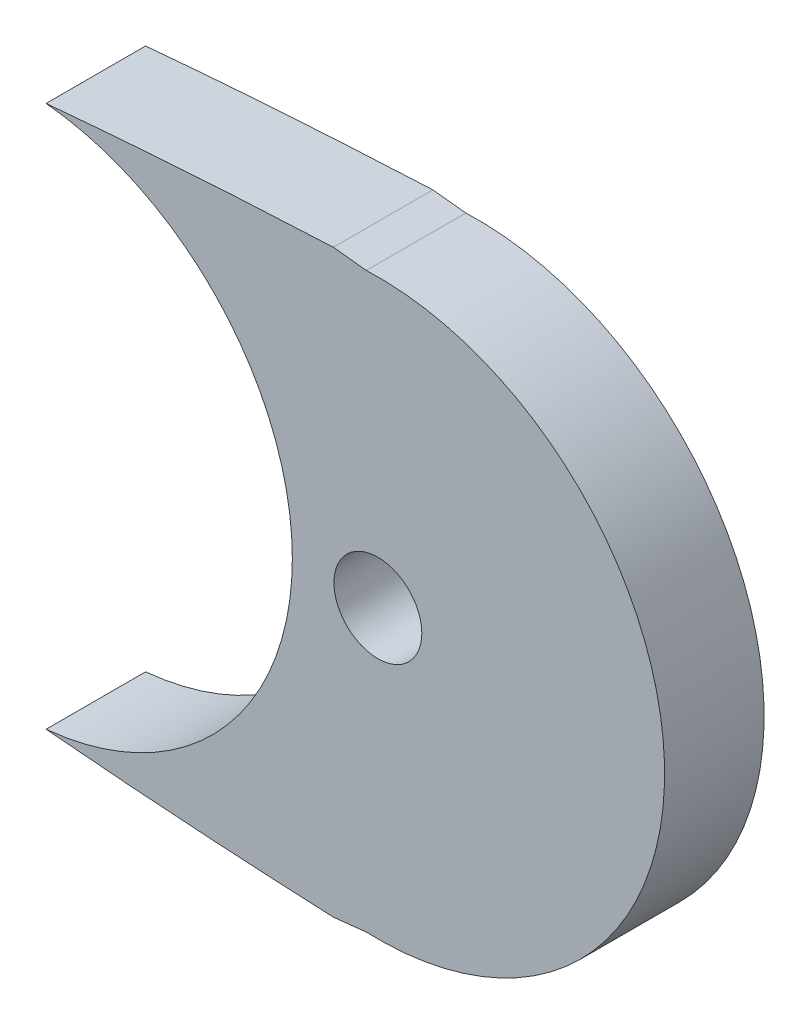
ISO-10303-21;
HEADER;
FILE_DESCRIPTION(('STEP AP214'),'2;1');
FILE_NAME('part.step','',(''),(''),'','','');
FILE_SCHEMA(('AUTOMOTIVE_DESIGN { 1 0 10303 214 1 1 1 1 }'));
ENDSEC;
DATA;
#1=APPLICATION_CONTEXT('core data for automotive mechanical design processes');
#2=APPLICATION_PROTOCOL_DEFINITION('international standard','automotive_design',2000,#1);
#3=PRODUCT_CONTEXT('',#1,'mechanical');
#4=PRODUCT('Part','Part','',(#3));
#5=PRODUCT_RELATED_PRODUCT_CATEGORY('part','',(#4));
#6=PRODUCT_DEFINITION_FORMATION('','',#4);
#7=PRODUCT_DEFINITION_CONTEXT('part definition',#1,'design');
#8=PRODUCT_DEFINITION('design','',#6,#7);
#9=PRODUCT_DEFINITION_SHAPE('','',#8);
#10=(LENGTH_UNIT() NAMED_UNIT(*) SI_UNIT(.MILLI.,.METRE.));
#11=(NAMED_UNIT(*) PLANE_ANGLE_UNIT() SI_UNIT($,.RADIAN.));
#12=(NAMED_UNIT(*) SI_UNIT($,.STERADIAN.) SOLID_ANGLE_UNIT());
#13=UNCERTAINTY_MEASURE_WITH_UNIT(LENGTH_MEASURE(1.E-05),#10,'distance_accuracy_value','');
#14=(GEOMETRIC_REPRESENTATION_CONTEXT(3) GLOBAL_UNCERTAINTY_ASSIGNED_CONTEXT((#13)) GLOBAL_UNIT_ASSIGNED_CONTEXT((#10,
#11,#12)) REPRESENTATION_CONTEXT('',''));
#15=CARTESIAN_POINT('',(0.,0.,0.));
#16=DIRECTION('',(0.,0.,1.));
#17=DIRECTION('',(1.,0.,0.));
#18=AXIS2_PLACEMENT_3D('',#15,#16,#17);
#19=CARTESIAN_POINT('',(300.,0.378,6.));
#20=CARTESIAN_POINT('',(299.845901447221,0.39961034336831,6.));
#21=CARTESIAN_POINT('',(299.230346714046,0.48593399083917,6.));
#22=CARTESIAN_POINT('',(297.848901683276,0.678531057447331,6.));
#23=CARTESIAN_POINT('',(295.556029122455,0.996787499241564,6.));
#24=CARTESIAN_POINT('',(292.365739581197,1.43343203295321,6.));
#25=CARTESIAN_POINT('',(288.297856433401,1.98344889126347,6.));
#26=CARTESIAN_POINT('',(283.377248038078,2.63572648359042,6.));
#27=CARTESIAN_POINT('',(277.63430498472,3.38149178862329,6.));
#28=CARTESIAN_POINT('',(271.104515413466,4.20901604095742,6.));
#29=CARTESIAN_POINT('',(263.828064626846,5.10718872872647,6.));
#30=CARTESIAN_POINT('',(255.849823781818,6.06276893212352,6.));
#31=CARTESIAN_POINT('',(247.21903434379,7.06424307195608,6.));
#32=CARTESIAN_POINT('',(237.988783489903,8.09787318806774,6.));
#33=CARTESIAN_POINT('',(228.216029511608,9.15107036010328,6.));
#34=CARTESIAN_POINT('',(217.961088379031,10.2107446574668,6.));
#35=CARTESIAN_POINT('',(207.287161839572,11.2632209265187,6.));
#36=CARTESIAN_POINT('',(196.260086850424,12.2937248064858,6.));
#37=CARTESIAN_POINT('',(184.947773044503,13.2887281219597,6.));
#38=CARTESIAN_POINT('',(173.420088229148,14.2315961384787,6.));
#39=CARTESIAN_POINT('',(161.747864995533,15.1069553720124,6.));
#40=CARTESIAN_POINT('',(150.00317252135,15.8985540753976,6.));
#41=CARTESIAN_POINT('',(138.258374542497,16.5898406039741,6.));
#42=CARTESIAN_POINT('',(126.585774705795,17.1633504747405,6.));
#43=CARTESIAN_POINT('',(115.057462615139,17.6037905135667,6.));
#44=CARTESIAN_POINT('',(103.744181572864,17.8967919128621,6.));
#45=CARTESIAN_POINT('',(92.7158453472272,18.0280433746414,6.));
#46=CARTESIAN_POINT('',(82.0402185013839,17.9871287273908,6.));
#47=CARTESIAN_POINT('',(71.7831190583338,17.7661449762132,6.));
#48=CARTESIAN_POINT('',(62.0076841473254,17.3594904245971,6.));
#49=CARTESIAN_POINT('',(52.7740834437817,16.7661013276277,6.));
#50=CARTESIAN_POINT('',(44.1390669938569,15.987763153894,6.));
#51=CARTESIAN_POINT('',(36.1554749512941,15.0305547578774,6.));
#52=CARTESIAN_POINT('',(28.8719698679608,13.9026205663682,6.));
#53=CARTESIAN_POINT('',(22.3326880228315,12.6157408879695,6.));
#54=CARTESIAN_POINT('',(16.5759570466198,11.1844668147641,6.));
#55=CARTESIAN_POINT('',(11.6344891822112,9.62275505380201,6.));
#56=CARTESIAN_POINT('',(7.53339032845527,7.94515078115887,6.));
#57=CARTESIAN_POINT('',(4.28573900369485,6.16300377839948,6.));
#58=CARTESIAN_POINT('',(1.8965325692393,4.27279663699588,6.));
#59=CARTESIAN_POINT('',(0.366265286449645,2.2288009510305,6.));
#60=CARTESIAN_POINT('',(-0.170692645797294,0.,6.));
#61=CARTESIAN_POINT('',(0.366265286449666,-2.22880095103055,6.));
#62=CARTESIAN_POINT('',(1.89653256923925,-4.27279663699582,6.));
#63=CARTESIAN_POINT('',(4.28573900369493,-6.16300377839955,6.));
#64=CARTESIAN_POINT('',(7.53339032845521,-7.94515078115883,6.));
#65=CARTESIAN_POINT('',(11.6344891822112,-9.62275505380201,6.));
#66=CARTESIAN_POINT('',(16.5759570466199,-11.1844668147641,6.));
#67=CARTESIAN_POINT('',(22.3326880228314,-12.6157408879695,6.));
#68=CARTESIAN_POINT('',(28.8719698679608,-13.9026205663682,6.));
#69=CARTESIAN_POINT('',(36.155474951294,-15.0305547578773,6.));
#70=CARTESIAN_POINT('',(44.1390669938569,-15.987763153894,6.));
#71=CARTESIAN_POINT('',(52.7740834437817,-16.7661013276277,6.));
#72=CARTESIAN_POINT('',(62.0076841473254,-17.3594904245971,6.));
#73=CARTESIAN_POINT('',(71.7831190583338,-17.7661449762132,6.));
#74=CARTESIAN_POINT('',(82.0402185013839,-17.9871287273908,6.));
#75=CARTESIAN_POINT('',(92.7158453472273,-18.0280433746414,6.));
#76=CARTESIAN_POINT('',(103.744181572864,-17.8967919128621,6.));
#77=CARTESIAN_POINT('',(115.057462615139,-17.6037905135667,6.));
#78=CARTESIAN_POINT('',(126.585774705795,-17.1633504747405,6.));
#79=CARTESIAN_POINT('',(138.258374542497,-16.5898406039741,6.));
#80=CARTESIAN_POINT('',(150.00317252135,-15.8985540753976,6.));
#81=CARTESIAN_POINT('',(161.747864995533,-15.1069553720124,6.));
#82=CARTESIAN_POINT('',(173.420088229148,-14.2315961384787,6.));
#83=CARTESIAN_POINT('',(184.947773044503,-13.2887281219597,6.));
#84=CARTESIAN_POINT('',(196.260086850424,-12.2937248064858,6.));
#85=CARTESIAN_POINT('',(207.287161839572,-11.2632209265187,6.));
#86=CARTESIAN_POINT('',(217.961088379031,-10.2107446574668,6.));
#87=CARTESIAN_POINT('',(228.216029511608,-9.15107036010328,6.));
#88=CARTESIAN_POINT('',(237.988783489903,-8.09787318806774,6.));
#89=CARTESIAN_POINT('',(247.21903434379,-7.06424307195608,6.));
#90=CARTESIAN_POINT('',(255.849823781818,-6.0627689321235,6.));
#91=CARTESIAN_POINT('',(263.828064626846,-5.10718872872648,6.));
#92=CARTESIAN_POINT('',(271.104515413466,-4.20901604095741,6.));
#93=CARTESIAN_POINT('',(277.63430498472,-3.38149178862329,6.));
#94=CARTESIAN_POINT('',(283.377248038078,-2.63572648359043,6.));
#95=CARTESIAN_POINT('',(288.297856433401,-1.98344889126346,6.));
#96=CARTESIAN_POINT('',(292.365739581198,-1.43343203295321,6.));
#97=CARTESIAN_POINT('',(295.556029122455,-0.996787499241567,6.));
#98=CARTESIAN_POINT('',(297.848901683276,-0.678531057447318,6.));
#99=CARTESIAN_POINT('',(299.230346714046,-0.48593399083919,6.));
#100=CARTESIAN_POINT('',(299.845901447221,-0.399610343368311,6.));
#101=CARTESIAN_POINT('',(300.,-0.378,6.));
#102=B_SPLINE_CURVE_WITH_KNOTS('',3,(#19,#20,#21,#22,#23,#24,#25,#26,#27,#28,#29,#30,#31,#32,
#33,#34,#35,#36,#37,#38,#39,#40,#41,#42,#43,#44,#45,#46,#47,#48,#49,#50,#51,#52,#53,#54,#55,#56,
#57,#58,#59,#60,#61,#62,#63,#64,#65,#66,#67,#68,#69,#70,#71,#72,#73,#74,#75,#76,#77,#78,#79,#80,
#81,#82,#83,#84,#85,#86,#87,#88,#89,#90,#91,#92,#93,#94,#95,#96,#97,#98,#99,#100,#101),
.UNSPECIFIED.,.F.,.F.,(4,1,1,1,1,1,1,1,1,1,1,1,1,1,1,1,1,1,1,1,1,1,1,1,1,1,1,1,1,1,1,1,1,1,1,1,
1,1,1,1,1,1,1,1,1,1,1,1,1,1,1,1,1,1,1,1,1,1,1,1,1,1,1,1,1,1,1,1,1,1,1,1,1,1,1,1,1,1,1,1,4),(0.,
0.000763156679271448,0.00304846929193477,0.00684068957953669,0.0121161317605396,
0.0188407924276644,0.0269727495182071,0.0364598537113803,0.0472429445210447,0.0592535547279477,
0.0724172643119224,0.0866510217067198,0.101866322474926,0.117968955401192,0.134857918638583,
0.152428309483259,0.170571841082248,0.189174521814913,0.208122338288737,0.227296649324545,
0.246580070424687,0.265853108019993,0.284996761496293,0.303895241632262,0.322432580929281,
0.340498658943124,0.357984483489282,0.37478811429809,0.390812303248415,0.405965006366899,
0.420162443159487,0.433328264782086,0.445393603392471,0.456301171479378,0.466003880875037,
0.474472000637231,0.481696232103684,0.487703697963338,0.492583405321472,0.496543603187854,0.5,
0.503456396812145,0.507416594678528,0.512296302036662,0.518303767896316,0.525527999362769,
0.533996119124963,0.543698828520622,0.554606396607529,0.566671735217914,0.579837556840513,
0.594034993633101,0.609187696751585,0.62521188570191,0.642015516510718,0.659501341056876,
0.677567419070719,0.696104758367738,0.715003238503707,0.734146891980006,0.753419929575313,
0.772703350675454,0.791877661711263,0.810825478185087,0.829428158917752,0.847571690516741,
0.865142081361417,0.882031044598807,0.898133677525074,0.91334897829328,0.927582735688077,
0.940746445272052,0.952757055478955,0.96354014628862,0.973027250481793,0.981159207572336,
0.98788386823946,0.993159310420463,0.996951530708065,0.999236843320729,1.),.UNSPECIFIED.);
#103=DIRECTION('',(0.,0.,-1.));
#104=VECTOR('',#103,1.);
#105=SURFACE_OF_LINEAR_EXTRUSION('',#102,#104);
#106=DIRECTION('',(0.,0.,1.));
#107=VECTOR('',#106,1.);
#108=CARTESIAN_POINT('',(65.5273106997542,17.4950200655024,0.));
#109=LINE('',#108,#107);
#110=CARTESIAN_POINT('',(65.5273106997542,17.4950200655024,0.));
#111=VERTEX_POINT('',#110);
#112=CARTESIAN_POINT('',(65.5273106997542,17.4950200655024,6.));
#113=VERTEX_POINT('',#112);
#114=EDGE_CURVE('E142',#111,#113,#109,.T.);
#115=ORIENTED_EDGE('',*,*,#114,.F.);
#116=CARTESIAN_POINT('',(300.,0.378,0.));
#117=CARTESIAN_POINT('',(299.845901447221,0.39961034336831,0.));
#118=CARTESIAN_POINT('',(299.230346714046,0.48593399083917,0.));
#119=CARTESIAN_POINT('',(297.848901683276,0.678531057447331,0.));
#120=CARTESIAN_POINT('',(295.556029122455,0.996787499241564,0.));
#121=CARTESIAN_POINT('',(292.365739581197,1.43343203295321,0.));
#122=CARTESIAN_POINT('',(288.297856433401,1.98344889126347,0.));
#123=CARTESIAN_POINT('',(283.377248038078,2.63572648359042,0.));
#124=CARTESIAN_POINT('',(277.63430498472,3.38149178862329,0.));
#125=CARTESIAN_POINT('',(271.104515413466,4.20901604095742,0.));
#126=CARTESIAN_POINT('',(263.828064626846,5.10718872872647,0.));
#127=CARTESIAN_POINT('',(255.849823781818,6.06276893212352,0.));
#128=CARTESIAN_POINT('',(247.21903434379,7.06424307195608,0.));
#129=CARTESIAN_POINT('',(237.988783489903,8.09787318806774,0.));
#130=CARTESIAN_POINT('',(228.216029511608,9.15107036010328,0.));
#131=CARTESIAN_POINT('',(217.961088379031,10.2107446574668,0.));
#132=CARTESIAN_POINT('',(207.287161839572,11.2632209265187,0.));
#133=CARTESIAN_POINT('',(196.260086850424,12.2937248064858,0.));
#134=CARTESIAN_POINT('',(184.947773044503,13.2887281219597,0.));
#135=CARTESIAN_POINT('',(173.420088229148,14.2315961384787,0.));
#136=CARTESIAN_POINT('',(161.747864995533,15.1069553720124,0.));
#137=CARTESIAN_POINT('',(150.00317252135,15.8985540753976,0.));
#138=CARTESIAN_POINT('',(138.258374542497,16.5898406039741,0.));
#139=CARTESIAN_POINT('',(126.585774705795,17.1633504747405,0.));
#140=CARTESIAN_POINT('',(115.057462615139,17.6037905135667,0.));
#141=CARTESIAN_POINT('',(103.744181572864,17.8967919128621,0.));
#142=CARTESIAN_POINT('',(92.7158453472272,18.0280433746414,0.));
#143=CARTESIAN_POINT('',(82.0402185013839,17.9871287273908,0.));
#144=CARTESIAN_POINT('',(71.7831190583338,17.7661449762132,0.));
#145=CARTESIAN_POINT('',(62.0076841473254,17.3594904245971,0.));
#146=CARTESIAN_POINT('',(52.7740834437817,16.7661013276277,0.));
#147=CARTESIAN_POINT('',(44.1390669938569,15.987763153894,0.));
#148=CARTESIAN_POINT('',(36.1554749512941,15.0305547578774,0.));
#149=CARTESIAN_POINT('',(28.8719698679608,13.9026205663682,0.));
#150=CARTESIAN_POINT('',(22.3326880228315,12.6157408879695,0.));
#151=CARTESIAN_POINT('',(16.5759570466198,11.1844668147641,0.));
#152=CARTESIAN_POINT('',(11.6344891822112,9.62275505380201,0.));
#153=CARTESIAN_POINT('',(7.53339032845527,7.94515078115887,0.));
#154=CARTESIAN_POINT('',(4.28573900369485,6.16300377839948,0.));
#155=CARTESIAN_POINT('',(1.8965325692393,4.27279663699588,0.));
#156=CARTESIAN_POINT('',(0.366265286449645,2.2288009510305,0.));
#157=CARTESIAN_POINT('',(-0.170692645797294,0.,0.));
#158=CARTESIAN_POINT('',(0.366265286449666,-2.22880095103055,0.));
#159=CARTESIAN_POINT('',(1.89653256923925,-4.27279663699582,0.));
#160=CARTESIAN_POINT('',(4.28573900369493,-6.16300377839955,0.));
#161=CARTESIAN_POINT('',(7.53339032845521,-7.94515078115883,0.));
#162=CARTESIAN_POINT('',(11.6344891822112,-9.62275505380201,0.));
#163=CARTESIAN_POINT('',(16.5759570466199,-11.1844668147641,0.));
#164=CARTESIAN_POINT('',(22.3326880228314,-12.6157408879695,0.));
#165=CARTESIAN_POINT('',(28.8719698679608,-13.9026205663682,0.));
#166=CARTESIAN_POINT('',(36.155474951294,-15.0305547578773,0.));
#167=CARTESIAN_POINT('',(44.1390669938569,-15.987763153894,0.));
#168=CARTESIAN_POINT('',(52.7740834437817,-16.7661013276277,0.));
#169=CARTESIAN_POINT('',(62.0076841473254,-17.3594904245971,0.));
#170=CARTESIAN_POINT('',(71.7831190583338,-17.7661449762132,0.));
#171=CARTESIAN_POINT('',(82.0402185013839,-17.9871287273908,0.));
#172=CARTESIAN_POINT('',(92.7158453472273,-18.0280433746414,0.));
#173=CARTESIAN_POINT('',(103.744181572864,-17.8967919128621,0.));
#174=CARTESIAN_POINT('',(115.057462615139,-17.6037905135667,0.));
#175=CARTESIAN_POINT('',(126.585774705795,-17.1633504747405,0.));
#176=CARTESIAN_POINT('',(138.258374542497,-16.5898406039741,0.));
#177=CARTESIAN_POINT('',(150.00317252135,-15.8985540753976,0.));
#178=CARTESIAN_POINT('',(161.747864995533,-15.1069553720124,0.));
#179=CARTESIAN_POINT('',(173.420088229148,-14.2315961384787,0.));
#180=CARTESIAN_POINT('',(184.947773044503,-13.2887281219597,0.));
#181=CARTESIAN_POINT('',(196.260086850424,-12.2937248064858,0.));
#182=CARTESIAN_POINT('',(207.287161839572,-11.2632209265187,0.));
#183=CARTESIAN_POINT('',(217.961088379031,-10.2107446574668,0.));
#184=CARTESIAN_POINT('',(228.216029511608,-9.15107036010328,0.));
#185=CARTESIAN_POINT('',(237.988783489903,-8.09787318806774,0.));
#186=CARTESIAN_POINT('',(247.21903434379,-7.06424307195608,0.));
#187=CARTESIAN_POINT('',(255.849823781818,-6.0627689321235,0.));
#188=CARTESIAN_POINT('',(263.828064626846,-5.10718872872648,0.));
#189=CARTESIAN_POINT('',(271.104515413466,-4.20901604095741,0.));
#190=CARTESIAN_POINT('',(277.63430498472,-3.38149178862329,0.));
#191=CARTESIAN_POINT('',(283.377248038078,-2.63572648359043,0.));
#192=CARTESIAN_POINT('',(288.297856433401,-1.98344889126346,0.));
#193=CARTESIAN_POINT('',(292.365739581198,-1.43343203295321,0.));
#194=CARTESIAN_POINT('',(295.556029122455,-0.996787499241567,0.));
#195=CARTESIAN_POINT('',(297.848901683276,-0.678531057447318,0.));
#196=CARTESIAN_POINT('',(299.230346714046,-0.48593399083919,0.));
#197=CARTESIAN_POINT('',(299.845901447221,-0.399610343368311,0.));
#198=CARTESIAN_POINT('',(300.,-0.378,0.));
#199=B_SPLINE_CURVE_WITH_KNOTS('',3,(#116,#117,#118,#119,#120,#121,#122,#123,#124,#125,#126,
#127,#128,#129,#130,#131,#132,#133,#134,#135,#136,#137,#138,#139,#140,#141,#142,#143,#144,#145,
#146,#147,#148,#149,#150,#151,#152,#153,#154,#155,#156,#157,#158,#159,#160,#161,#162,#163,#164,
#165,#166,#167,#168,#169,#170,#171,#172,#173,#174,#175,#176,#177,#178,#179,#180,#181,#182,#183,
#184,#185,#186,#187,#188,#189,#190,#191,#192,#193,#194,#195,#196,#197,#198),.UNSPECIFIED.,.F.,
.F.,(4,1,1,1,1,1,1,1,1,1,1,1,1,1,1,1,1,1,1,1,1,1,1,1,1,1,1,1,1,1,1,1,1,1,1,1,1,1,1,1,1,1,1,1,1,
1,1,1,1,1,1,1,1,1,1,1,1,1,1,1,1,1,1,1,1,1,1,1,1,1,1,1,1,1,1,1,1,1,1,1,4),(0.,
0.000763156679271448,0.00304846929193477,0.00684068957953669,0.0121161317605396,
0.0188407924276644,0.0269727495182071,0.0364598537113803,0.0472429445210447,0.0592535547279477,
0.0724172643119224,0.0866510217067198,0.101866322474926,0.117968955401192,0.134857918638583,
0.152428309483259,0.170571841082248,0.189174521814913,0.208122338288737,0.227296649324545,
0.246580070424687,0.265853108019993,0.284996761496293,0.303895241632262,0.322432580929281,
0.340498658943124,0.357984483489282,0.37478811429809,0.390812303248415,0.405965006366899,
0.420162443159487,0.433328264782086,0.445393603392471,0.456301171479378,0.466003880875037,
0.474472000637231,0.481696232103684,0.487703697963338,0.492583405321472,0.496543603187854,0.5,
0.503456396812145,0.507416594678528,0.512296302036662,0.518303767896316,0.525527999362769,
0.533996119124963,0.543698828520622,0.554606396607529,0.566671735217914,0.579837556840513,
0.594034993633101,0.609187696751585,0.62521188570191,0.642015516510718,0.659501341056876,
0.677567419070719,0.696104758367738,0.715003238503707,0.734146891980006,0.753419929575313,
0.772703350675454,0.791877661711263,0.810825478185087,0.829428158917752,0.847571690516741,
0.865142081361417,0.882031044598807,0.898133677525074,0.91334897829328,0.927582735688077,
0.940746445272052,0.952757055478955,0.96354014628862,0.973027250481793,0.981159207572336,
0.98788386823946,0.993159310420463,0.996951530708065,0.999236843320729,1.),.UNSPECIFIED.);
#200=CARTESIAN_POINT('',(48.1975371862923,16.3434678002833,0.));
#201=VERTEX_POINT('',#200);
#202=EDGE_CURVE('E210',#111,#201,#199,.T.);
#203=ORIENTED_EDGE('',*,*,#202,.T.);
#204=DIRECTION('',(0.,0.,1.));
#205=VECTOR('',#204,1.);
#206=CARTESIAN_POINT('',(48.1975371862922,16.3434678002833,0.));
#207=LINE('',#206,#205);
#208=CARTESIAN_POINT('',(48.1975371862922,16.3434678002833,6.));
#209=VERTEX_POINT('',#208);
#210=EDGE_CURVE('E64',#201,#209,#207,.T.);
#211=ORIENTED_EDGE('',*,*,#210,.T.);
#212=EDGE_CURVE('E56',#113,#209,#102,.T.);
#213=ORIENTED_EDGE('',*,*,#212,.F.);
#214=EDGE_LOOP('',(#115,#203,#211,#213));
#215=FACE_BOUND('',#214,.T.);
#216=ADVANCED_FACE('F45',(#215),#105,.F.);
#217=CARTESIAN_POINT('',(0.,0.,6.));
#218=DIRECTION('',(0.,0.,1.));
#219=DIRECTION('',(1.,0.,0.));
#220=AXIS2_PLACEMENT_3D('',#217,#218,#219);
#221=PLANE('',#220);
#222=CARTESIAN_POINT('',(68.2098517870718,0.,6.));
#223=DIRECTION('',(0.,0.,1.));
#224=DIRECTION('',(1.,0.,0.));
#225=AXIS2_PLACEMENT_3D('',#222,#223,#224);
#226=CIRCLE('',#225,2.65);
#227=CARTESIAN_POINT('',(70.8598517870718,0.,6.));
#228=VERTEX_POINT('',#227);
#229=EDGE_CURVE('E11',#228,#228,#226,.T.);
#230=ORIENTED_EDGE('',*,*,#229,.F.);
#231=EDGE_LOOP('',(#230));
#232=FACE_BOUND('',#231,.T.);
#233=CARTESIAN_POINT('',(68.2098517870718,0.,6.));
#234=DIRECTION('',(0.,0.,1.));
#235=DIRECTION('',(1.,0.,0.));
#236=AXIS2_PLACEMENT_3D('',#233,#234,#235);
#237=CIRCLE('',#236,17.2932548417885);
#238=CARTESIAN_POINT('',(67.5121043853475,-17.2791727691585,6.));
#239=VERTEX_POINT('',#238);
#240=CARTESIAN_POINT('',(67.5121043853475,17.2791727691584,6.));
#241=VERTEX_POINT('',#240);
#242=EDGE_CURVE('E109',#239,#241,#237,.T.);
#243=ORIENTED_EDGE('',*,*,#242,.T.);
#244=DIRECTION('',(-0.994138604542644,0.108113065621152,0.));
#245=VECTOR('',#244,1.);
#246=CARTESIAN_POINT('',(2.6462654821681,24.3333648766431,6.));
#247=LINE('',#246,#245);
#248=EDGE_CURVE('E125',#241,#113,#247,.T.);
#249=ORIENTED_EDGE('',*,*,#248,.T.);
#250=ORIENTED_EDGE('',*,*,#212,.T.);
#251=CARTESIAN_POINT('',(46.632238895324,0.,6.));
#252=DIRECTION('',(0.,0.,1.));
#253=DIRECTION('',(1.,0.,0.));
#254=AXIS2_PLACEMENT_3D('',#251,#252,#253);
#255=CIRCLE('',#254,16.4182550375673);
#256=CARTESIAN_POINT('',(48.1975371862863,-16.3434678002827,6.));
#257=VERTEX_POINT('',#256);
#258=EDGE_CURVE('E151',#257,#209,#255,.T.);
#259=ORIENTED_EDGE('',*,*,#258,.F.);
#260=CARTESIAN_POINT('',(300.,0.378,6.));
#261=CARTESIAN_POINT('',(299.845901447221,0.39961034336831,6.));
#262=CARTESIAN_POINT('',(299.230346714046,0.48593399083917,6.));
#263=CARTESIAN_POINT('',(297.848901683276,0.678531057447331,6.));
#264=CARTESIAN_POINT('',(295.556029122455,0.996787499241564,6.));
#265=CARTESIAN_POINT('',(292.365739581197,1.43343203295321,6.));
#266=CARTESIAN_POINT('',(288.297856433401,1.98344889126347,6.));
#267=CARTESIAN_POINT('',(283.377248038078,2.63572648359042,6.));
#268=CARTESIAN_POINT('',(277.63430498472,3.38149178862329,6.));
#269=CARTESIAN_POINT('',(271.104515413466,4.20901604095742,6.));
#270=CARTESIAN_POINT('',(263.828064626846,5.10718872872647,6.));
#271=CARTESIAN_POINT('',(255.849823781818,6.06276893212352,6.));
#272=CARTESIAN_POINT('',(247.21903434379,7.06424307195608,6.));
#273=CARTESIAN_POINT('',(237.988783489903,8.09787318806774,6.));
#274=CARTESIAN_POINT('',(228.216029511608,9.15107036010328,6.));
#275=CARTESIAN_POINT('',(217.961088379031,10.2107446574668,6.));
#276=CARTESIAN_POINT('',(207.287161839572,11.2632209265187,6.));
#277=CARTESIAN_POINT('',(196.260086850424,12.2937248064858,6.));
#278=CARTESIAN_POINT('',(184.947773044503,13.2887281219597,6.));
#279=CARTESIAN_POINT('',(173.420088229148,14.2315961384787,6.));
#280=CARTESIAN_POINT('',(161.747864995533,15.1069553720124,6.));
#281=CARTESIAN_POINT('',(150.00317252135,15.8985540753976,6.));
#282=CARTESIAN_POINT('',(138.258374542497,16.5898406039741,6.));
#283=CARTESIAN_POINT('',(126.585774705795,17.1633504747405,6.));
#284=CARTESIAN_POINT('',(115.057462615139,17.6037905135667,6.));
#285=CARTESIAN_POINT('',(103.744181572864,17.8967919128621,6.));
#286=CARTESIAN_POINT('',(92.7158453472272,18.0280433746414,6.));
#287=CARTESIAN_POINT('',(82.0402185013839,17.9871287273908,6.));
#288=CARTESIAN_POINT('',(71.7831190583338,17.7661449762132,6.));
#289=CARTESIAN_POINT('',(62.0076841473254,17.3594904245971,6.));
#290=CARTESIAN_POINT('',(52.7740834437817,16.7661013276277,6.));
#291=CARTESIAN_POINT('',(44.1390669938569,15.987763153894,6.));
#292=CARTESIAN_POINT('',(36.1554749512941,15.0305547578774,6.));
#293=CARTESIAN_POINT('',(28.8719698679608,13.9026205663682,6.));
#294=CARTESIAN_POINT('',(22.3326880228315,12.6157408879695,6.));
#295=CARTESIAN_POINT('',(16.5759570466198,11.1844668147641,6.));
#296=CARTESIAN_POINT('',(11.6344891822112,9.62275505380201,6.));
#297=CARTESIAN_POINT('',(7.53339032845527,7.94515078115887,6.));
#298=CARTESIAN_POINT('',(4.28573900369485,6.16300377839948,6.));
#299=CARTESIAN_POINT('',(1.8965325692393,4.27279663699588,6.));
#300=CARTESIAN_POINT('',(0.366265286449645,2.2288009510305,6.));
#301=CARTESIAN_POINT('',(-0.170692645797294,0.,6.));
#302=CARTESIAN_POINT('',(0.366265286449666,-2.22880095103055,6.));
#303=CARTESIAN_POINT('',(1.89653256923925,-4.27279663699582,6.));
#304=CARTESIAN_POINT('',(4.28573900369493,-6.16300377839955,6.));
#305=CARTESIAN_POINT('',(7.53339032845521,-7.94515078115883,6.));
#306=CARTESIAN_POINT('',(11.6344891822112,-9.62275505380201,6.));
#307=CARTESIAN_POINT('',(16.5759570466199,-11.1844668147641,6.));
#308=CARTESIAN_POINT('',(22.3326880228314,-12.6157408879695,6.));
#309=CARTESIAN_POINT('',(28.8719698679608,-13.9026205663682,6.));
#310=CARTESIAN_POINT('',(36.155474951294,-15.0305547578773,6.));
#311=CARTESIAN_POINT('',(44.1390669938569,-15.987763153894,6.));
#312=CARTESIAN_POINT('',(52.7740834437817,-16.7661013276277,6.));
#313=CARTESIAN_POINT('',(62.0076841473254,-17.3594904245971,6.));
#314=CARTESIAN_POINT('',(71.7831190583338,-17.7661449762132,6.));
#315=CARTESIAN_POINT('',(82.0402185013839,-17.9871287273908,6.));
#316=CARTESIAN_POINT('',(92.7158453472273,-18.0280433746414,6.));
#317=CARTESIAN_POINT('',(103.744181572864,-17.8967919128621,6.));
#318=CARTESIAN_POINT('',(115.057462615139,-17.6037905135667,6.));
#319=CARTESIAN_POINT('',(126.585774705795,-17.1633504747405,6.));
#320=CARTESIAN_POINT('',(138.258374542497,-16.5898406039741,6.));
#321=CARTESIAN_POINT('',(150.00317252135,-15.8985540753976,6.));
#322=CARTESIAN_POINT('',(161.747864995533,-15.1069553720124,6.));
#323=CARTESIAN_POINT('',(173.420088229148,-14.2315961384787,6.));
#324=CARTESIAN_POINT('',(184.947773044503,-13.2887281219597,6.));
#325=CARTESIAN_POINT('',(196.260086850424,-12.2937248064858,6.));
#326=CARTESIAN_POINT('',(207.287161839572,-11.2632209265187,6.));
#327=CARTESIAN_POINT('',(217.961088379031,-10.2107446574668,6.));
#328=CARTESIAN_POINT('',(228.216029511608,-9.15107036010328,6.));
#329=CARTESIAN_POINT('',(237.988783489903,-8.09787318806774,6.));
#330=CARTESIAN_POINT('',(247.21903434379,-7.06424307195608,6.));
#331=CARTESIAN_POINT('',(255.849823781818,-6.0627689321235,6.));
#332=CARTESIAN_POINT('',(263.828064626846,-5.10718872872648,6.));
#333=CARTESIAN_POINT('',(271.104515413466,-4.20901604095741,6.));
#334=CARTESIAN_POINT('',(277.63430498472,-3.38149178862329,6.));
#335=CARTESIAN_POINT('',(283.377248038078,-2.63572648359043,6.));
#336=CARTESIAN_POINT('',(288.297856433401,-1.98344889126346,6.));
#337=CARTESIAN_POINT('',(292.365739581198,-1.43343203295321,6.));
#338=CARTESIAN_POINT('',(295.556029122455,-0.996787499241567,6.));
#339=CARTESIAN_POINT('',(297.848901683276,-0.678531057447318,6.));
#340=CARTESIAN_POINT('',(299.230346714046,-0.48593399083919,6.));
#341=CARTESIAN_POINT('',(299.845901447221,-0.399610343368311,6.));
#342=CARTESIAN_POINT('',(300.,-0.378,6.));
#343=B_SPLINE_CURVE_WITH_KNOTS('',3,(#260,#261,#262,#263,#264,#265,#266,#267,#268,#269,#270,
#271,#272,#273,#274,#275,#276,#277,#278,#279,#280,#281,#282,#283,#284,#285,#286,#287,#288,#289,
#290,#291,#292,#293,#294,#295,#296,#297,#298,#299,#300,#301,#302,#303,#304,#305,#306,#307,#308,
#309,#310,#311,#312,#313,#314,#315,#316,#317,#318,#319,#320,#321,#322,#323,#324,#325,#326,#327,
#328,#329,#330,#331,#332,#333,#334,#335,#336,#337,#338,#339,#340,#341,#342),.UNSPECIFIED.,.F.,
.F.,(4,1,1,1,1,1,1,1,1,1,1,1,1,1,1,1,1,1,1,1,1,1,1,1,1,1,1,1,1,1,1,1,1,1,1,1,1,1,1,1,1,1,1,1,1,
1,1,1,1,1,1,1,1,1,1,1,1,1,1,1,1,1,1,1,1,1,1,1,1,1,1,1,1,1,1,1,1,1,1,1,4),(0.,
0.000763156679271448,0.00304846929193477,0.00684068957953669,0.0121161317605396,
0.0188407924276644,0.0269727495182071,0.0364598537113803,0.0472429445210447,0.0592535547279477,
0.0724172643119224,0.0866510217067198,0.101866322474926,0.117968955401192,0.134857918638583,
0.152428309483259,0.170571841082248,0.189174521814913,0.208122338288737,0.227296649324545,
0.246580070424687,0.265853108019993,0.284996761496293,0.303895241632262,0.322432580929281,
0.340498658943124,0.357984483489282,0.37478811429809,0.390812303248415,0.405965006366899,
0.420162443159487,0.433328264782086,0.445393603392471,0.456301171479378,0.466003880875037,
0.474472000637231,0.481696232103684,0.487703697963338,0.492583405321472,0.496543603187854,0.5,
0.503456396812145,0.507416594678528,0.512296302036662,0.518303767896316,0.525527999362769,
0.533996119124963,0.543698828520622,0.554606396607529,0.566671735217914,0.579837556840513,
0.594034993633101,0.609187696751585,0.62521188570191,0.642015516510718,0.659501341056876,
0.677567419070719,0.696104758367738,0.715003238503707,0.734146891980006,0.753419929575313,
0.772703350675454,0.791877661711263,0.810825478185087,0.829428158917752,0.847571690516741,
0.865142081361417,0.882031044598807,0.898133677525074,0.91334897829328,0.927582735688077,
0.940746445272052,0.952757055478955,0.96354014628862,0.973027250481793,0.981159207572336,
0.98788386823946,0.993159310420463,0.996951530708065,0.999236843320729,1.),.UNSPECIFIED.);
#344=CARTESIAN_POINT('',(65.5273106997527,-17.4950200655023,6.));
#345=VERTEX_POINT('',#344);
#346=EDGE_CURVE('E157',#257,#345,#343,.T.);
#347=ORIENTED_EDGE('',*,*,#346,.T.);
#348=DIRECTION('',(-0.994138604542659,-0.108113065621023,0.));
#349=VECTOR('',#348,1.);
#350=CARTESIAN_POINT('',(2.64626548216401,-24.333364876635,6.));
#351=LINE('',#350,#349);
#352=EDGE_CURVE('E129',#239,#345,#351,.T.);
#353=ORIENTED_EDGE('',*,*,#352,.F.);
#354=EDGE_LOOP('',(#243,#249,#250,#259,#347,#353));
#355=FACE_BOUND('',#354,.T.);
#356=ADVANCED_FACE('F178',(#232,#355),#221,.T.);
#357=CARTESIAN_POINT('',(0.,0.,0.));
#358=DIRECTION('',(0.,0.,1.));
#359=DIRECTION('',(1.,0.,0.));
#360=AXIS2_PLACEMENT_3D('',#357,#358,#359);
#361=PLANE('',#360);
#362=CARTESIAN_POINT('',(68.2098517870718,0.,0.));
#363=DIRECTION('',(0.,0.,1.));
#364=DIRECTION('',(1.,0.,0.));
#365=AXIS2_PLACEMENT_3D('',#362,#363,#364);
#366=CIRCLE('',#365,2.65);
#367=CARTESIAN_POINT('',(70.8598517870718,0.,0.));
#368=VERTEX_POINT('',#367);
#369=EDGE_CURVE('E50',#368,#368,#366,.T.);
#370=ORIENTED_EDGE('',*,*,#369,.T.);
#371=EDGE_LOOP('',(#370));
#372=FACE_BOUND('',#371,.T.);
#373=DIRECTION('',(-0.994138604542644,0.108113065621152,0.));
#374=VECTOR('',#373,1.);
#375=CARTESIAN_POINT('',(2.6462654821681,24.3333648766431,0.));
#376=LINE('',#375,#374);
#377=CARTESIAN_POINT('',(67.5121043853475,17.2791727691584,0.));
#378=VERTEX_POINT('',#377);
#379=EDGE_CURVE('E112',#378,#111,#376,.T.);
#380=ORIENTED_EDGE('',*,*,#379,.F.);
#381=CARTESIAN_POINT('',(68.2098517870718,0.,0.));
#382=DIRECTION('',(0.,0.,1.));
#383=DIRECTION('',(1.,0.,0.));
#384=AXIS2_PLACEMENT_3D('',#381,#382,#383);
#385=CIRCLE('',#384,17.2932548417885);
#386=CARTESIAN_POINT('',(67.5121043853475,-17.2791727691585,0.));
#387=VERTEX_POINT('',#386);
#388=EDGE_CURVE('E106',#387,#378,#385,.T.);
#389=ORIENTED_EDGE('',*,*,#388,.F.);
#390=DIRECTION('',(-0.994138604542659,-0.108113065621023,0.));
#391=VECTOR('',#390,1.);
#392=CARTESIAN_POINT('',(2.64626548216401,-24.333364876635,0.));
#393=LINE('',#392,#391);
#394=CARTESIAN_POINT('',(65.5273106997527,-17.4950200655023,0.));
#395=VERTEX_POINT('',#394);
#396=EDGE_CURVE('E114',#387,#395,#393,.T.);
#397=ORIENTED_EDGE('',*,*,#396,.T.);
#398=CARTESIAN_POINT('',(300.,0.378,0.));
#399=CARTESIAN_POINT('',(299.845901447221,0.39961034336831,0.));
#400=CARTESIAN_POINT('',(299.230346714046,0.48593399083917,0.));
#401=CARTESIAN_POINT('',(297.848901683276,0.678531057447331,0.));
#402=CARTESIAN_POINT('',(295.556029122455,0.996787499241564,0.));
#403=CARTESIAN_POINT('',(292.365739581197,1.43343203295321,0.));
#404=CARTESIAN_POINT('',(288.297856433401,1.98344889126347,0.));
#405=CARTESIAN_POINT('',(283.377248038078,2.63572648359042,0.));
#406=CARTESIAN_POINT('',(277.63430498472,3.38149178862329,0.));
#407=CARTESIAN_POINT('',(271.104515413466,4.20901604095742,0.));
#408=CARTESIAN_POINT('',(263.828064626846,5.10718872872647,0.));
#409=CARTESIAN_POINT('',(255.849823781818,6.06276893212352,0.));
#410=CARTESIAN_POINT('',(247.21903434379,7.06424307195608,0.));
#411=CARTESIAN_POINT('',(237.988783489903,8.09787318806774,0.));
#412=CARTESIAN_POINT('',(228.216029511608,9.15107036010328,0.));
#413=CARTESIAN_POINT('',(217.961088379031,10.2107446574668,0.));
#414=CARTESIAN_POINT('',(207.287161839572,11.2632209265187,0.));
#415=CARTESIAN_POINT('',(196.260086850424,12.2937248064858,0.));
#416=CARTESIAN_POINT('',(184.947773044503,13.2887281219597,0.));
#417=CARTESIAN_POINT('',(173.420088229148,14.2315961384787,0.));
#418=CARTESIAN_POINT('',(161.747864995533,15.1069553720124,0.));
#419=CARTESIAN_POINT('',(150.00317252135,15.8985540753976,0.));
#420=CARTESIAN_POINT('',(138.258374542497,16.5898406039741,0.));
#421=CARTESIAN_POINT('',(126.585774705795,17.1633504747405,0.));
#422=CARTESIAN_POINT('',(115.057462615139,17.6037905135667,0.));
#423=CARTESIAN_POINT('',(103.744181572864,17.8967919128621,0.));
#424=CARTESIAN_POINT('',(92.7158453472272,18.0280433746414,0.));
#425=CARTESIAN_POINT('',(82.0402185013839,17.9871287273908,0.));
#426=CARTESIAN_POINT('',(71.7831190583338,17.7661449762132,0.));
#427=CARTESIAN_POINT('',(62.0076841473254,17.3594904245971,0.));
#428=CARTESIAN_POINT('',(52.7740834437817,16.7661013276277,0.));
#429=CARTESIAN_POINT('',(44.1390669938569,15.987763153894,0.));
#430=CARTESIAN_POINT('',(36.1554749512941,15.0305547578774,0.));
#431=CARTESIAN_POINT('',(28.8719698679608,13.9026205663682,0.));
#432=CARTESIAN_POINT('',(22.3326880228315,12.6157408879695,0.));
#433=CARTESIAN_POINT('',(16.5759570466198,11.1844668147641,0.));
#434=CARTESIAN_POINT('',(11.6344891822112,9.62275505380201,0.));
#435=CARTESIAN_POINT('',(7.53339032845527,7.94515078115887,0.));
#436=CARTESIAN_POINT('',(4.28573900369485,6.16300377839948,0.));
#437=CARTESIAN_POINT('',(1.8965325692393,4.27279663699588,0.));
#438=CARTESIAN_POINT('',(0.366265286449645,2.2288009510305,0.));
#439=CARTESIAN_POINT('',(-0.170692645797294,0.,0.));
#440=CARTESIAN_POINT('',(0.366265286449666,-2.22880095103055,0.));
#441=CARTESIAN_POINT('',(1.89653256923925,-4.27279663699582,0.));
#442=CARTESIAN_POINT('',(4.28573900369493,-6.16300377839955,0.));
#443=CARTESIAN_POINT('',(7.53339032845521,-7.94515078115883,0.));
#444=CARTESIAN_POINT('',(11.6344891822112,-9.62275505380201,0.));
#445=CARTESIAN_POINT('',(16.5759570466199,-11.1844668147641,0.));
#446=CARTESIAN_POINT('',(22.3326880228314,-12.6157408879695,0.));
#447=CARTESIAN_POINT('',(28.8719698679608,-13.9026205663682,0.));
#448=CARTESIAN_POINT('',(36.155474951294,-15.0305547578773,0.));
#449=CARTESIAN_POINT('',(44.1390669938569,-15.987763153894,0.));
#450=CARTESIAN_POINT('',(52.7740834437817,-16.7661013276277,0.));
#451=CARTESIAN_POINT('',(62.0076841473254,-17.3594904245971,0.));
#452=CARTESIAN_POINT('',(71.7831190583338,-17.7661449762132,0.));
#453=CARTESIAN_POINT('',(82.0402185013839,-17.9871287273908,0.));
#454=CARTESIAN_POINT('',(92.7158453472273,-18.0280433746414,0.));
#455=CARTESIAN_POINT('',(103.744181572864,-17.8967919128621,0.));
#456=CARTESIAN_POINT('',(115.057462615139,-17.6037905135667,0.));
#457=CARTESIAN_POINT('',(126.585774705795,-17.1633504747405,0.));
#458=CARTESIAN_POINT('',(138.258374542497,-16.5898406039741,0.));
#459=CARTESIAN_POINT('',(150.00317252135,-15.8985540753976,0.));
#460=CARTESIAN_POINT('',(161.747864995533,-15.1069553720124,0.));
#461=CARTESIAN_POINT('',(173.420088229148,-14.2315961384787,0.));
#462=CARTESIAN_POINT('',(184.947773044503,-13.2887281219597,0.));
#463=CARTESIAN_POINT('',(196.260086850424,-12.2937248064858,0.));
#464=CARTESIAN_POINT('',(207.287161839572,-11.2632209265187,0.));
#465=CARTESIAN_POINT('',(217.961088379031,-10.2107446574668,0.));
#466=CARTESIAN_POINT('',(228.216029511608,-9.15107036010328,0.));
#467=CARTESIAN_POINT('',(237.988783489903,-8.09787318806774,0.));
#468=CARTESIAN_POINT('',(247.21903434379,-7.06424307195608,0.));
#469=CARTESIAN_POINT('',(255.849823781818,-6.0627689321235,0.));
#470=CARTESIAN_POINT('',(263.828064626846,-5.10718872872648,0.));
#471=CARTESIAN_POINT('',(271.104515413466,-4.20901604095741,0.));
#472=CARTESIAN_POINT('',(277.63430498472,-3.38149178862329,0.));
#473=CARTESIAN_POINT('',(283.377248038078,-2.63572648359043,0.));
#474=CARTESIAN_POINT('',(288.297856433401,-1.98344889126346,0.));
#475=CARTESIAN_POINT('',(292.365739581198,-1.43343203295321,0.));
#476=CARTESIAN_POINT('',(295.556029122455,-0.996787499241567,0.));
#477=CARTESIAN_POINT('',(297.848901683276,-0.678531057447318,0.));
#478=CARTESIAN_POINT('',(299.230346714046,-0.48593399083919,0.));
#479=CARTESIAN_POINT('',(299.845901447221,-0.399610343368311,0.));
#480=CARTESIAN_POINT('',(300.,-0.378,0.));
#481=B_SPLINE_CURVE_WITH_KNOTS('',3,(#398,#399,#400,#401,#402,#403,#404,#405,#406,#407,#408,
#409,#410,#411,#412,#413,#414,#415,#416,#417,#418,#419,#420,#421,#422,#423,#424,#425,#426,#427,
#428,#429,#430,#431,#432,#433,#434,#435,#436,#437,#438,#439,#440,#441,#442,#443,#444,#445,#446,
#447,#448,#449,#450,#451,#452,#453,#454,#455,#456,#457,#458,#459,#460,#461,#462,#463,#464,#465,
#466,#467,#468,#469,#470,#471,#472,#473,#474,#475,#476,#477,#478,#479,#480),.UNSPECIFIED.,.F.,
.F.,(4,1,1,1,1,1,1,1,1,1,1,1,1,1,1,1,1,1,1,1,1,1,1,1,1,1,1,1,1,1,1,1,1,1,1,1,1,1,1,1,1,1,1,1,1,
1,1,1,1,1,1,1,1,1,1,1,1,1,1,1,1,1,1,1,1,1,1,1,1,1,1,1,1,1,1,1,1,1,1,1,4),(0.,
0.000763156679271448,0.00304846929193477,0.00684068957953669,0.0121161317605396,
0.0188407924276644,0.0269727495182071,0.0364598537113803,0.0472429445210447,0.0592535547279477,
0.0724172643119224,0.0866510217067198,0.101866322474926,0.117968955401192,0.134857918638583,
0.152428309483259,0.170571841082248,0.189174521814913,0.208122338288737,0.227296649324545,
0.246580070424687,0.265853108019993,0.284996761496293,0.303895241632262,0.322432580929281,
0.340498658943124,0.357984483489282,0.37478811429809,0.390812303248415,0.405965006366899,
0.420162443159487,0.433328264782086,0.445393603392471,0.456301171479378,0.466003880875037,
0.474472000637231,0.481696232103684,0.487703697963338,0.492583405321472,0.496543603187854,0.5,
0.503456396812145,0.507416594678528,0.512296302036662,0.518303767896316,0.525527999362769,
0.533996119124963,0.543698828520622,0.554606396607529,0.566671735217914,0.579837556840513,
0.594034993633101,0.609187696751585,0.62521188570191,0.642015516510718,0.659501341056876,
0.677567419070719,0.696104758367738,0.715003238503707,0.734146891980006,0.753419929575313,
0.772703350675454,0.791877661711263,0.810825478185087,0.829428158917752,0.847571690516741,
0.865142081361417,0.882031044598807,0.898133677525074,0.91334897829328,0.927582735688077,
0.940746445272052,0.952757055478955,0.96354014628862,0.973027250481793,0.981159207572336,
0.98788386823946,0.993159310420463,0.996951530708065,0.999236843320729,1.),.UNSPECIFIED.);
#482=CARTESIAN_POINT('',(48.1975371862863,-16.3434678002827,0.));
#483=VERTEX_POINT('',#482);
#484=EDGE_CURVE('E141',#483,#395,#481,.T.);
#485=ORIENTED_EDGE('',*,*,#484,.F.);
#486=CARTESIAN_POINT('',(46.632238895324,0.,0.));
#487=DIRECTION('',(0.,0.,1.));
#488=DIRECTION('',(1.,0.,0.));
#489=AXIS2_PLACEMENT_3D('',#486,#487,#488);
#490=CIRCLE('',#489,16.4182550375673);
#491=EDGE_CURVE('E147',#483,#201,#490,.T.);
#492=ORIENTED_EDGE('',*,*,#491,.T.);
#493=ORIENTED_EDGE('',*,*,#202,.F.);
#494=EDGE_LOOP('',(#380,#389,#397,#485,#492,#493));
#495=FACE_BOUND('',#494,.T.);
#496=ADVANCED_FACE('F122',(#372,#495),#361,.F.);
#497=DIRECTION('',(0.,0.,-1.));
#498=VECTOR('',#497,1.);
#499=SURFACE_OF_LINEAR_EXTRUSION('',#343,#498);
#500=ORIENTED_EDGE('',*,*,#484,.T.);
#501=DIRECTION('',(0.,0.,1.));
#502=VECTOR('',#501,1.);
#503=CARTESIAN_POINT('',(65.5273106997527,-17.4950200655023,0.));
#504=LINE('',#503,#502);
#505=EDGE_CURVE('E72',#395,#345,#504,.T.);
#506=ORIENTED_EDGE('',*,*,#505,.T.);
#507=ORIENTED_EDGE('',*,*,#346,.F.);
#508=DIRECTION('',(0.,0.,1.));
#509=VECTOR('',#508,1.);
#510=CARTESIAN_POINT('',(48.1975371862863,-16.3434678002827,0.));
#511=LINE('',#510,#509);
#512=EDGE_CURVE('E150',#483,#257,#511,.T.);
#513=ORIENTED_EDGE('',*,*,#512,.F.);
#514=EDGE_LOOP('',(#500,#506,#507,#513));
#515=FACE_BOUND('',#514,.T.);
#516=ADVANCED_FACE('F47',(#515),#499,.F.);
#517=CARTESIAN_POINT('',(68.2098517870718,0.,6.));
#518=DIRECTION('',(0.,0.,-1.));
#519=DIRECTION('',(-1.,0.,0.));
#520=AXIS2_PLACEMENT_3D('',#517,#518,#519);
#521=CYLINDRICAL_SURFACE('',#520,2.65);
#522=ORIENTED_EDGE('',*,*,#229,.T.);
#523=EDGE_LOOP('',(#522));
#524=FACE_BOUND('',#523,.T.);
#525=ORIENTED_EDGE('',*,*,#369,.F.);
#526=EDGE_LOOP('',(#525));
#527=FACE_BOUND('',#526,.T.);
#528=ADVANCED_FACE('F180',(#524,#527),#521,.F.);
#529=CARTESIAN_POINT('',(46.632238895324,0.,0.));
#530=DIRECTION('',(0.,0.,1.));
#531=DIRECTION('',(1.,0.,0.));
#532=AXIS2_PLACEMENT_3D('',#529,#530,#531);
#533=CYLINDRICAL_SURFACE('',#532,16.4182550375673);
#534=ORIENTED_EDGE('',*,*,#258,.T.);
#535=ORIENTED_EDGE('',*,*,#210,.F.);
#536=ORIENTED_EDGE('',*,*,#491,.F.);
#537=ORIENTED_EDGE('',*,*,#512,.T.);
#538=EDGE_LOOP('',(#534,#535,#536,#537));
#539=FACE_BOUND('',#538,.T.);
#540=ADVANCED_FACE('F183',(#539),#533,.F.);
#541=CARTESIAN_POINT('',(68.2098517870718,0.,0.));
#542=DIRECTION('',(0.,0.,1.));
#543=DIRECTION('',(1.,0.,0.));
#544=AXIS2_PLACEMENT_3D('',#541,#542,#543);
#545=CYLINDRICAL_SURFACE('',#544,17.2932548417885);
#546=ORIENTED_EDGE('',*,*,#242,.F.);
#547=DIRECTION('',(0.,0.,1.));
#548=VECTOR('',#547,1.);
#549=CARTESIAN_POINT('',(67.5121043853475,-17.2791727691585,0.));
#550=LINE('',#549,#548);
#551=EDGE_CURVE('E102',#387,#239,#550,.T.);
#552=ORIENTED_EDGE('',*,*,#551,.F.);
#553=ORIENTED_EDGE('',*,*,#388,.T.);
#554=DIRECTION('',(0.,0.,1.));
#555=VECTOR('',#554,1.);
#556=CARTESIAN_POINT('',(67.5121043853475,17.2791727691584,0.));
#557=LINE('',#556,#555);
#558=EDGE_CURVE('E138',#378,#241,#557,.T.);
#559=ORIENTED_EDGE('',*,*,#558,.T.);
#560=EDGE_LOOP('',(#546,#552,#553,#559));
#561=FACE_BOUND('',#560,.T.);
#562=ADVANCED_FACE('F103',(#561),#545,.T.);
#563=CARTESIAN_POINT('',(2.6462654821681,24.3333648766431,0.));
#564=DIRECTION('',(0.108113065621152,0.994138604542644,0.));
#565=DIRECTION('',(-0.994138604542645,0.108113065621152,0.));
#566=AXIS2_PLACEMENT_3D('',#563,#564,#565);
#567=PLANE('',#566);
#568=ORIENTED_EDGE('',*,*,#248,.F.);
#569=ORIENTED_EDGE('',*,*,#558,.F.);
#570=ORIENTED_EDGE('',*,*,#379,.T.);
#571=ORIENTED_EDGE('',*,*,#114,.T.);
#572=EDGE_LOOP('',(#568,#569,#570,#571));
#573=FACE_BOUND('',#572,.T.);
#574=ADVANCED_FACE('F195',(#573),#567,.T.);
#575=CARTESIAN_POINT('',(2.64626548216401,-24.333364876635,0.));
#576=DIRECTION('',(-0.108113065621023,0.994138604542659,0.));
#577=DIRECTION('',(-0.994138604542659,-0.108113065621023,0.));
#578=AXIS2_PLACEMENT_3D('',#575,#576,#577);
#579=PLANE('',#578);
#580=ORIENTED_EDGE('',*,*,#352,.T.);
#581=ORIENTED_EDGE('',*,*,#505,.F.);
#582=ORIENTED_EDGE('',*,*,#396,.F.);
#583=ORIENTED_EDGE('',*,*,#551,.T.);
#584=EDGE_LOOP('',(#580,#581,#582,#583));
#585=FACE_BOUND('',#584,.T.);
#586=ADVANCED_FACE('F115',(#585),#579,.F.);
#587=CLOSED_SHELL('',(#216,#356,#496,#516,#528,#540,#562,#574,#586));
#588=MANIFOLD_SOLID_BREP('B2',#587);
#589=ADVANCED_BREP_SHAPE_REPRESENTATION('',(#18,#588),#14);
#590=SHAPE_DEFINITION_REPRESENTATION(#9,#589);
ENDSEC;
END-ISO-10303-21;
